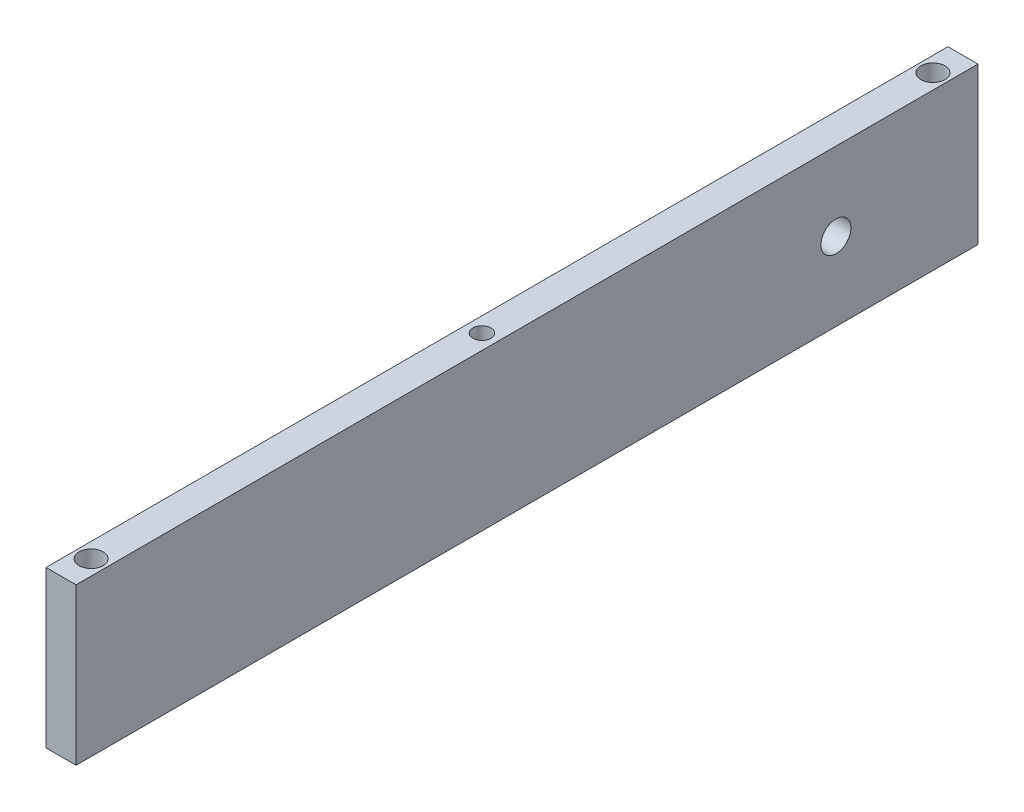
ISO-10303-21;
HEADER;
FILE_DESCRIPTION(('STEP AP214'),'2;1');
FILE_NAME('part.step','',(''),(''),'','','');
FILE_SCHEMA(('AUTOMOTIVE_DESIGN { 1 0 10303 214 1 1 1 1 }'));
ENDSEC;
DATA;
#1=APPLICATION_CONTEXT('core data for automotive mechanical design processes');
#2=APPLICATION_PROTOCOL_DEFINITION('international standard','automotive_design',2000,#1);
#3=PRODUCT_CONTEXT('',#1,'mechanical');
#4=PRODUCT('Part','Part','',(#3));
#5=PRODUCT_RELATED_PRODUCT_CATEGORY('part','',(#4));
#6=PRODUCT_DEFINITION_FORMATION('','',#4);
#7=PRODUCT_DEFINITION_CONTEXT('part definition',#1,'design');
#8=PRODUCT_DEFINITION('design','',#6,#7);
#9=PRODUCT_DEFINITION_SHAPE('','',#8);
#10=(LENGTH_UNIT() NAMED_UNIT(*) SI_UNIT(.MILLI.,.METRE.));
#11=(NAMED_UNIT(*) PLANE_ANGLE_UNIT() SI_UNIT($,.RADIAN.));
#12=(NAMED_UNIT(*) SI_UNIT($,.STERADIAN.) SOLID_ANGLE_UNIT());
#13=UNCERTAINTY_MEASURE_WITH_UNIT(LENGTH_MEASURE(1.E-05),#10,'distance_accuracy_value','');
#14=(GEOMETRIC_REPRESENTATION_CONTEXT(3) GLOBAL_UNCERTAINTY_ASSIGNED_CONTEXT((#13)) GLOBAL_UNIT_ASSIGNED_CONTEXT((#10,
#11,#12)) REPRESENTATION_CONTEXT('',''));
#15=CARTESIAN_POINT('',(0.,0.,0.));
#16=DIRECTION('',(0.,0.,1.));
#17=DIRECTION('',(1.,0.,0.));
#18=AXIS2_PLACEMENT_3D('',#15,#16,#17);
#19=CARTESIAN_POINT('',(-6.35,0.,-190.5));
#20=DIRECTION('',(0.,-1.,0.));
#21=DIRECTION('',(0.,0.,-1.));
#22=AXIS2_PLACEMENT_3D('',#19,#20,#21);
#23=PLANE('',#22);
#24=CARTESIAN_POINT('',(-3.175,0.,-6.35));
#25=DIRECTION('',(0.,1.,0.));
#26=DIRECTION('',(0.,0.,1.));
#27=AXIS2_PLACEMENT_3D('',#24,#25,#26);
#28=CIRCLE('',#27,2.54);
#29=CARTESIAN_POINT('',(-3.175,0.,-3.81));
#30=VERTEX_POINT('',#29);
#31=EDGE_CURVE('E155',#30,#30,#28,.T.);
#32=ORIENTED_EDGE('',*,*,#31,.T.);
#33=EDGE_LOOP('',(#32));
#34=FACE_BOUND('',#33,.T.);
#35=CARTESIAN_POINT('',(-3.175,0.,-184.15));
#36=DIRECTION('',(0.,1.,0.));
#37=DIRECTION('',(0.,0.,1.));
#38=AXIS2_PLACEMENT_3D('',#35,#36,#37);
#39=CIRCLE('',#38,2.54000000000001);
#40=CARTESIAN_POINT('',(-3.175,0.,-181.61));
#41=VERTEX_POINT('',#40);
#42=EDGE_CURVE('E172',#41,#41,#39,.T.);
#43=ORIENTED_EDGE('',*,*,#42,.T.);
#44=EDGE_LOOP('',(#43));
#45=FACE_BOUND('',#44,.T.);
#46=CARTESIAN_POINT('',(-3.17500000000115,0.,-88.9000000000007));
#47=DIRECTION('',(0.,1.,0.));
#48=DIRECTION('',(0.,0.,1.));
#49=AXIS2_PLACEMENT_3D('',#46,#47,#48);
#50=CIRCLE('',#49,1.90499999999997);
#51=CARTESIAN_POINT('',(-3.17500000000115,0.,-86.9950000000007));
#52=VERTEX_POINT('',#51);
#53=EDGE_CURVE('E164',#52,#52,#50,.T.);
#54=ORIENTED_EDGE('',*,*,#53,.T.);
#55=EDGE_LOOP('',(#54));
#56=FACE_BOUND('',#55,.T.);
#57=DIRECTION('',(1.,0.,0.));
#58=VECTOR('',#57,1.);
#59=CARTESIAN_POINT('',(-6.35,0.,0.));
#60=LINE('',#59,#58);
#61=CARTESIAN_POINT('',(-6.35,0.,0.));
#62=VERTEX_POINT('',#61);
#63=CARTESIAN_POINT('',(0.,0.,0.));
#64=VERTEX_POINT('',#63);
#65=EDGE_CURVE('E114',#62,#64,#60,.T.);
#66=ORIENTED_EDGE('',*,*,#65,.F.);
#67=DIRECTION('',(0.,0.,1.));
#68=VECTOR('',#67,1.);
#69=CARTESIAN_POINT('',(-6.35,0.,-190.5));
#70=LINE('',#69,#68);
#71=CARTESIAN_POINT('',(-6.35,0.,-190.5));
#72=VERTEX_POINT('',#71);
#73=EDGE_CURVE('E11',#72,#62,#70,.T.);
#74=ORIENTED_EDGE('',*,*,#73,.F.);
#75=DIRECTION('',(1.,0.,0.));
#76=VECTOR('',#75,1.);
#77=CARTESIAN_POINT('',(-6.35,0.,-190.5));
#78=LINE('',#77,#76);
#79=CARTESIAN_POINT('',(0.,0.,-190.5));
#80=VERTEX_POINT('',#79);
#81=EDGE_CURVE('E105',#72,#80,#78,.T.);
#82=ORIENTED_EDGE('',*,*,#81,.T.);
#83=DIRECTION('',(0.,0.,1.));
#84=VECTOR('',#83,1.);
#85=CARTESIAN_POINT('',(0.,0.,-190.5));
#86=LINE('',#85,#84);
#87=EDGE_CURVE('E46',#80,#64,#86,.T.);
#88=ORIENTED_EDGE('',*,*,#87,.T.);
#89=EDGE_LOOP('',(#66,#74,#82,#88));
#90=FACE_BOUND('',#89,.T.);
#91=ADVANCED_FACE('F43',(#34,#45,#56,#90),#23,.T.);
#92=CARTESIAN_POINT('',(-6.35,0.,-190.5));
#93=DIRECTION('',(-1.,0.,0.));
#94=DIRECTION('',(0.,0.,1.));
#95=AXIS2_PLACEMENT_3D('',#92,#93,#94);
#96=PLANE('',#95);
#97=CARTESIAN_POINT('',(-6.35,16.51,-160.5000092));
#98=DIRECTION('',(-1.,0.,0.));
#99=DIRECTION('',(0.,-1.,0.));
#100=AXIS2_PLACEMENT_3D('',#97,#98,#99);
#101=CIRCLE('',#100,3.175);
#102=CARTESIAN_POINT('',(-6.35,13.335,-160.5000092));
#103=VERTEX_POINT('',#102);
#104=EDGE_CURVE('E119',#103,#103,#101,.T.);
#105=ORIENTED_EDGE('',*,*,#104,.F.);
#106=EDGE_LOOP('',(#105));
#107=FACE_BOUND('',#106,.T.);
#108=DIRECTION('',(0.,-1.,0.));
#109=VECTOR('',#108,1.);
#110=CARTESIAN_POINT('',(-6.35,0.,0.));
#111=LINE('',#110,#109);
#112=CARTESIAN_POINT('',(-6.35,33.02,0.));
#113=VERTEX_POINT('',#112);
#114=EDGE_CURVE('E108',#113,#62,#111,.T.);
#115=ORIENTED_EDGE('',*,*,#114,.F.);
#116=DIRECTION('',(0.,0.,1.));
#117=VECTOR('',#116,1.);
#118=CARTESIAN_POINT('',(-6.35,33.02,-190.5));
#119=LINE('',#118,#117);
#120=CARTESIAN_POINT('',(-6.35,33.02,-190.5));
#121=VERTEX_POINT('',#120);
#122=EDGE_CURVE('E53',#121,#113,#119,.T.);
#123=ORIENTED_EDGE('',*,*,#122,.F.);
#124=DIRECTION('',(0.,-1.,0.));
#125=VECTOR('',#124,1.);
#126=CARTESIAN_POINT('',(-6.35,0.,-190.5));
#127=LINE('',#126,#125);
#128=EDGE_CURVE('E100',#121,#72,#127,.T.);
#129=ORIENTED_EDGE('',*,*,#128,.T.);
#130=ORIENTED_EDGE('',*,*,#73,.T.);
#131=EDGE_LOOP('',(#115,#123,#129,#130));
#132=FACE_BOUND('',#131,.T.);
#133=ADVANCED_FACE('F131',(#107,#132),#96,.T.);
#134=CARTESIAN_POINT('',(-6.35,33.02,-190.5));
#135=DIRECTION('',(0.,1.,0.));
#136=DIRECTION('',(0.,0.,1.));
#137=AXIS2_PLACEMENT_3D('',#134,#135,#136);
#138=PLANE('',#137);
#139=CARTESIAN_POINT('',(-3.175,33.02,-6.35));
#140=DIRECTION('',(0.,1.,0.));
#141=DIRECTION('',(0.,0.,1.));
#142=AXIS2_PLACEMENT_3D('',#139,#140,#141);
#143=CIRCLE('',#142,2.54);
#144=CARTESIAN_POINT('',(-3.175,33.02,-3.81));
#145=VERTEX_POINT('',#144);
#146=EDGE_CURVE('E161',#145,#145,#143,.T.);
#147=ORIENTED_EDGE('',*,*,#146,.F.);
#148=EDGE_LOOP('',(#147));
#149=FACE_BOUND('',#148,.T.);
#150=CARTESIAN_POINT('',(-3.175,33.02,-184.15));
#151=DIRECTION('',(0.,1.,0.));
#152=DIRECTION('',(0.,0.,1.));
#153=AXIS2_PLACEMENT_3D('',#150,#151,#152);
#154=CIRCLE('',#153,2.54000000000001);
#155=CARTESIAN_POINT('',(-3.175,33.02,-181.61));
#156=VERTEX_POINT('',#155);
#157=EDGE_CURVE('E176',#156,#156,#154,.T.);
#158=ORIENTED_EDGE('',*,*,#157,.F.);
#159=EDGE_LOOP('',(#158));
#160=FACE_BOUND('',#159,.T.);
#161=CARTESIAN_POINT('',(-3.17500000000115,33.02,-88.9000000000007));
#162=DIRECTION('',(0.,1.,0.));
#163=DIRECTION('',(0.,0.,1.));
#164=AXIS2_PLACEMENT_3D('',#161,#162,#163);
#165=CIRCLE('',#164,1.90499999999997);
#166=CARTESIAN_POINT('',(-3.17500000000115,33.02,-86.9950000000007));
#167=VERTEX_POINT('',#166);
#168=EDGE_CURVE('E168',#167,#167,#165,.T.);
#169=ORIENTED_EDGE('',*,*,#168,.F.);
#170=EDGE_LOOP('',(#169));
#171=FACE_BOUND('',#170,.T.);
#172=DIRECTION('',(-1.,0.,0.));
#173=VECTOR('',#172,1.);
#174=CARTESIAN_POINT('',(-6.35,33.02,0.));
#175=LINE('',#174,#173);
#176=CARTESIAN_POINT('',(0.,33.02,0.));
#177=VERTEX_POINT('',#176);
#178=EDGE_CURVE('E94',#177,#113,#175,.T.);
#179=ORIENTED_EDGE('',*,*,#178,.F.);
#180=DIRECTION('',(0.,0.,1.));
#181=VECTOR('',#180,1.);
#182=CARTESIAN_POINT('',(0.,33.02,-190.5));
#183=LINE('',#182,#181);
#184=CARTESIAN_POINT('',(0.,33.02,-190.5));
#185=VERTEX_POINT('',#184);
#186=EDGE_CURVE('E89',#185,#177,#183,.T.);
#187=ORIENTED_EDGE('',*,*,#186,.F.);
#188=DIRECTION('',(-1.,0.,0.));
#189=VECTOR('',#188,1.);
#190=CARTESIAN_POINT('',(-6.35,33.02,-190.5));
#191=LINE('',#190,#189);
#192=EDGE_CURVE('E92',#185,#121,#191,.T.);
#193=ORIENTED_EDGE('',*,*,#192,.T.);
#194=ORIENTED_EDGE('',*,*,#122,.T.);
#195=EDGE_LOOP('',(#179,#187,#193,#194));
#196=FACE_BOUND('',#195,.T.);
#197=ADVANCED_FACE('F91',(#149,#160,#171,#196),#138,.T.);
#198=CARTESIAN_POINT('',(0.,33.02,-190.5));
#199=DIRECTION('',(1.,0.,0.));
#200=DIRECTION('',(0.,1.,0.));
#201=AXIS2_PLACEMENT_3D('',#198,#199,#200);
#202=PLANE('',#201);
#203=CARTESIAN_POINT('',(0.,16.51,-160.5000092));
#204=DIRECTION('',(1.,0.,0.));
#205=DIRECTION('',(0.,1.,0.));
#206=AXIS2_PLACEMENT_3D('',#203,#204,#205);
#207=CIRCLE('',#206,3.175);
#208=CARTESIAN_POINT('',(0.,13.335,-160.5000092));
#209=VERTEX_POINT('',#208);
#210=EDGE_CURVE('E152',#209,#209,#207,.F.);
#211=ORIENTED_EDGE('',*,*,#210,.T.);
#212=EDGE_LOOP('',(#211));
#213=FACE_BOUND('',#212,.T.);
#214=DIRECTION('',(0.,1.,0.));
#215=VECTOR('',#214,1.);
#216=CARTESIAN_POINT('',(0.,33.02,0.));
#217=LINE('',#216,#215);
#218=EDGE_CURVE('E118',#64,#177,#217,.T.);
#219=ORIENTED_EDGE('',*,*,#218,.F.);
#220=ORIENTED_EDGE('',*,*,#87,.F.);
#221=DIRECTION('',(0.,1.,0.));
#222=VECTOR('',#221,1.);
#223=CARTESIAN_POINT('',(0.,33.02,-190.5));
#224=LINE('',#223,#222);
#225=EDGE_CURVE('E99',#80,#185,#224,.T.);
#226=ORIENTED_EDGE('',*,*,#225,.T.);
#227=ORIENTED_EDGE('',*,*,#186,.T.);
#228=EDGE_LOOP('',(#219,#220,#226,#227));
#229=FACE_BOUND('',#228,.T.);
#230=ADVANCED_FACE('F103',(#213,#229),#202,.T.);
#231=CARTESIAN_POINT('',(0.,0.,-190.5));
#232=DIRECTION('',(0.,0.,-1.));
#233=DIRECTION('',(-1.,0.,0.));
#234=AXIS2_PLACEMENT_3D('',#231,#232,#233);
#235=PLANE('',#234);
#236=ORIENTED_EDGE('',*,*,#81,.F.);
#237=ORIENTED_EDGE('',*,*,#128,.F.);
#238=ORIENTED_EDGE('',*,*,#192,.F.);
#239=ORIENTED_EDGE('',*,*,#225,.F.);
#240=EDGE_LOOP('',(#236,#237,#238,#239));
#241=FACE_BOUND('',#240,.T.);
#242=ADVANCED_FACE('F98',(#241),#235,.T.);
#243=CARTESIAN_POINT('',(0.,0.,0.));
#244=DIRECTION('',(0.,0.,-1.));
#245=DIRECTION('',(-1.,0.,0.));
#246=AXIS2_PLACEMENT_3D('',#243,#244,#245);
#247=PLANE('',#246);
#248=ORIENTED_EDGE('',*,*,#65,.T.);
#249=ORIENTED_EDGE('',*,*,#218,.T.);
#250=ORIENTED_EDGE('',*,*,#178,.T.);
#251=ORIENTED_EDGE('',*,*,#114,.T.);
#252=EDGE_LOOP('',(#248,#249,#250,#251));
#253=FACE_BOUND('',#252,.T.);
#254=ADVANCED_FACE('F130',(#253),#247,.F.);
#255=CARTESIAN_POINT('',(0.00100000000000187,16.51,-160.5000092));
#256=DIRECTION('',(-1.,0.,0.));
#257=DIRECTION('',(0.,-1.,0.));
#258=AXIS2_PLACEMENT_3D('',#255,#256,#257);
#259=CYLINDRICAL_SURFACE('',#258,3.175);
#260=CARTESIAN_POINT('',(0.,13.335,-160.5000092));
#261=CARTESIAN_POINT('',(-0.0661458333333335,13.335,-160.5000092));
#262=CARTESIAN_POINT('',(-0.132291666666667,13.335,-160.5000092));
#263=CARTESIAN_POINT('',(-0.264583333333333,13.335,-160.5000092));
#264=CARTESIAN_POINT('',(-0.330729166666667,13.335,-160.5000092));
#265=CARTESIAN_POINT('',(-0.463020833333333,13.335,-160.5000092));
#266=CARTESIAN_POINT('',(-0.529166666666667,13.335,-160.5000092));
#267=CARTESIAN_POINT('',(-0.661458333333333,13.335,-160.5000092));
#268=CARTESIAN_POINT('',(-0.727604166666667,13.335,-160.5000092));
#269=CARTESIAN_POINT('',(-0.859895833333333,13.335,-160.5000092));
#270=CARTESIAN_POINT('',(-0.926041666666667,13.335,-160.5000092));
#271=CARTESIAN_POINT('',(-1.05833333333333,13.335,-160.5000092));
#272=CARTESIAN_POINT('',(-1.12447916666667,13.335,-160.5000092));
#273=CARTESIAN_POINT('',(-1.25677083333333,13.335,-160.5000092));
#274=CARTESIAN_POINT('',(-1.32291666666667,13.335,-160.5000092));
#275=CARTESIAN_POINT('',(-1.45520833333333,13.335,-160.5000092));
#276=CARTESIAN_POINT('',(-1.52135416666667,13.335,-160.5000092));
#277=CARTESIAN_POINT('',(-1.65364583333333,13.335,-160.5000092));
#278=CARTESIAN_POINT('',(-1.71979166666667,13.335,-160.5000092));
#279=CARTESIAN_POINT('',(-1.85208333333333,13.335,-160.5000092));
#280=CARTESIAN_POINT('',(-1.91822916666667,13.335,-160.5000092));
#281=CARTESIAN_POINT('',(-2.05052083333333,13.335,-160.5000092));
#282=CARTESIAN_POINT('',(-2.11666666666667,13.335,-160.5000092));
#283=CARTESIAN_POINT('',(-2.24895833333333,13.335,-160.5000092));
#284=CARTESIAN_POINT('',(-2.31510416666667,13.335,-160.5000092));
#285=CARTESIAN_POINT('',(-2.44739583333333,13.335,-160.5000092));
#286=CARTESIAN_POINT('',(-2.51354166666667,13.335,-160.5000092));
#287=CARTESIAN_POINT('',(-2.64583333333333,13.335,-160.5000092));
#288=CARTESIAN_POINT('',(-2.71197916666667,13.335,-160.5000092));
#289=CARTESIAN_POINT('',(-2.84427083333333,13.335,-160.5000092));
#290=CARTESIAN_POINT('',(-2.91041666666667,13.335,-160.5000092));
#291=CARTESIAN_POINT('',(-3.04270833333333,13.335,-160.5000092));
#292=CARTESIAN_POINT('',(-3.10885416666667,13.335,-160.5000092));
#293=CARTESIAN_POINT('',(-3.24114583333333,13.335,-160.5000092));
#294=CARTESIAN_POINT('',(-3.30729166666667,13.335,-160.5000092));
#295=CARTESIAN_POINT('',(-3.43958333333333,13.335,-160.5000092));
#296=CARTESIAN_POINT('',(-3.50572916666667,13.335,-160.5000092));
#297=CARTESIAN_POINT('',(-3.63802083333333,13.335,-160.5000092));
#298=CARTESIAN_POINT('',(-3.70416666666667,13.335,-160.5000092));
#299=CARTESIAN_POINT('',(-3.83645833333333,13.335,-160.5000092));
#300=CARTESIAN_POINT('',(-3.90260416666667,13.335,-160.5000092));
#301=CARTESIAN_POINT('',(-4.03489583333333,13.335,-160.5000092));
#302=CARTESIAN_POINT('',(-4.10104166666667,13.335,-160.5000092));
#303=CARTESIAN_POINT('',(-4.23333333333333,13.335,-160.5000092));
#304=CARTESIAN_POINT('',(-4.29947916666667,13.335,-160.5000092));
#305=CARTESIAN_POINT('',(-4.43177083333333,13.335,-160.5000092));
#306=CARTESIAN_POINT('',(-4.49791666666667,13.335,-160.5000092));
#307=CARTESIAN_POINT('',(-4.63020833333333,13.335,-160.5000092));
#308=CARTESIAN_POINT('',(-4.69635416666667,13.335,-160.5000092));
#309=CARTESIAN_POINT('',(-4.82864583333333,13.335,-160.5000092));
#310=CARTESIAN_POINT('',(-4.89479166666667,13.335,-160.5000092));
#311=CARTESIAN_POINT('',(-5.02708333333333,13.335,-160.5000092));
#312=CARTESIAN_POINT('',(-5.09322916666667,13.335,-160.5000092));
#313=CARTESIAN_POINT('',(-5.22552083333333,13.335,-160.5000092));
#314=CARTESIAN_POINT('',(-5.29166666666667,13.335,-160.5000092));
#315=CARTESIAN_POINT('',(-5.42395833333333,13.335,-160.5000092));
#316=CARTESIAN_POINT('',(-5.49010416666667,13.335,-160.5000092));
#317=CARTESIAN_POINT('',(-5.62239583333333,13.335,-160.5000092));
#318=CARTESIAN_POINT('',(-5.68854166666667,13.335,-160.5000092));
#319=CARTESIAN_POINT('',(-5.82083333333333,13.335,-160.5000092));
#320=CARTESIAN_POINT('',(-5.88697916666667,13.335,-160.5000092));
#321=CARTESIAN_POINT('',(-6.01927083333333,13.335,-160.5000092));
#322=CARTESIAN_POINT('',(-6.08541666666667,13.335,-160.5000092));
#323=CARTESIAN_POINT('',(-6.21770833333333,13.335,-160.5000092));
#324=CARTESIAN_POINT('',(-6.28385416666667,13.335,-160.5000092));
#325=CARTESIAN_POINT('',(-6.35,13.335,-160.5000092));
#326=B_SPLINE_CURVE_WITH_KNOTS('',3,(#260,#261,#262,#263,#264,#265,#266,#267,#268,#269,#270,
#271,#272,#273,#274,#275,#276,#277,#278,#279,#280,#281,#282,#283,#284,#285,#286,#287,#288,#289,
#290,#291,#292,#293,#294,#295,#296,#297,#298,#299,#300,#301,#302,#303,#304,#305,#306,#307,#308,
#309,#310,#311,#312,#313,#314,#315,#316,#317,#318,#319,#320,#321,#322,#323,#324,#325),
.UNSPECIFIED.,.F.,.F.,(4,2,2,2,2,2,2,2,2,2,2,2,2,2,2,2,2,2,2,2,2,2,2,2,2,2,2,2,2,2,2,2,4),(0.,
0.1984375,0.396875,0.5953125,0.79375,0.9921875,1.190625,1.3890625,1.5875,1.7859375,1.984375,
2.1828125,2.38125,2.5796875,2.778125,2.9765625,3.175,3.3734375,3.571875,3.7703125,3.96875,
4.1671875,4.365625,4.5640625,4.7625,4.9609375,5.159375,5.3578125,5.55625,5.7546875,5.953125,
6.1515625,6.35),.UNSPECIFIED.);
#327=EDGE_CURVE('BSEAM193',#209,#103,#326,.T.);
#328=ORIENTED_EDGE('',*,*,#210,.F.);
#329=ORIENTED_EDGE('',*,*,#104,.T.);
#330=ORIENTED_EDGE('',*,*,#327,.T.);
#331=ORIENTED_EDGE('',*,*,#327,.F.);
#332=EDGE_LOOP('',(#328,#330,#329,#331));
#333=FACE_BOUND('',#332,.T.);
#334=ADVANCED_FACE('F193',(#333),#259,.F.);
#335=CARTESIAN_POINT('',(-3.17500000000115,0.,-88.9000000000007));
#336=DIRECTION('',(0.,1.,0.));
#337=DIRECTION('',(0.,0.,1.));
#338=AXIS2_PLACEMENT_3D('',#335,#336,#337);
#339=CYLINDRICAL_SURFACE('',#338,1.90499999999997);
#340=ORIENTED_EDGE('',*,*,#53,.F.);
#341=EDGE_LOOP('',(#340));
#342=FACE_BOUND('',#341,.T.);
#343=ORIENTED_EDGE('',*,*,#168,.T.);
#344=EDGE_LOOP('',(#343));
#345=FACE_BOUND('',#344,.T.);
#346=ADVANCED_FACE('F190',(#342,#345),#339,.F.);
#347=CARTESIAN_POINT('',(-3.175,0.,-184.15));
#348=DIRECTION('',(0.,1.,0.));
#349=DIRECTION('',(0.,0.,1.));
#350=AXIS2_PLACEMENT_3D('',#347,#348,#349);
#351=CYLINDRICAL_SURFACE('',#350,2.54000000000001);
#352=ORIENTED_EDGE('',*,*,#42,.F.);
#353=EDGE_LOOP('',(#352));
#354=FACE_BOUND('',#353,.T.);
#355=ORIENTED_EDGE('',*,*,#157,.T.);
#356=EDGE_LOOP('',(#355));
#357=FACE_BOUND('',#356,.T.);
#358=ADVANCED_FACE('F192',(#354,#357),#351,.F.);
#359=CARTESIAN_POINT('',(-3.175,0.,-6.35));
#360=DIRECTION('',(0.,1.,0.));
#361=DIRECTION('',(0.,0.,1.));
#362=AXIS2_PLACEMENT_3D('',#359,#360,#361);
#363=CYLINDRICAL_SURFACE('',#362,2.54);
#364=ORIENTED_EDGE('',*,*,#31,.F.);
#365=EDGE_LOOP('',(#364));
#366=FACE_BOUND('',#365,.T.);
#367=ORIENTED_EDGE('',*,*,#146,.T.);
#368=EDGE_LOOP('',(#367));
#369=FACE_BOUND('',#368,.T.);
#370=ADVANCED_FACE('F184',(#366,#369),#363,.F.);
#371=CLOSED_SHELL('',(#91,#133,#197,#230,#242,#254,#334,#346,#358,#370));
#372=MANIFOLD_SOLID_BREP('B2',#371);
#373=ADVANCED_BREP_SHAPE_REPRESENTATION('',(#18,#372),#14);
#374=SHAPE_DEFINITION_REPRESENTATION(#9,#373);
ENDSEC;
END-ISO-10303-21;
